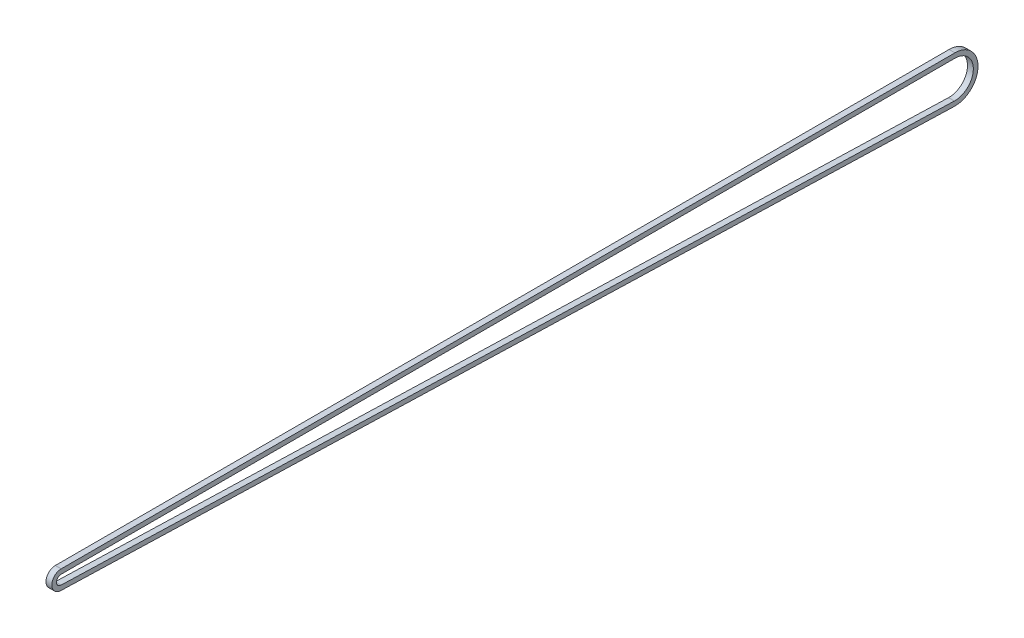
ISO-10303-21;
HEADER;
FILE_DESCRIPTION(('STEP AP214'),'2;1');
FILE_NAME('part.step','',(''),(''),'','','');
FILE_SCHEMA(('AUTOMOTIVE_DESIGN { 1 0 10303 214 1 1 1 1 }'));
ENDSEC;
DATA;
#1=APPLICATION_CONTEXT('core data for automotive mechanical design processes');
#2=APPLICATION_PROTOCOL_DEFINITION('international standard','automotive_design',2000,#1);
#3=PRODUCT_CONTEXT('',#1,'mechanical');
#4=PRODUCT('Part','Part','',(#3));
#5=PRODUCT_RELATED_PRODUCT_CATEGORY('part','',(#4));
#6=PRODUCT_DEFINITION_FORMATION('','',#4);
#7=PRODUCT_DEFINITION_CONTEXT('part definition',#1,'design');
#8=PRODUCT_DEFINITION('design','',#6,#7);
#9=PRODUCT_DEFINITION_SHAPE('','',#8);
#10=(LENGTH_UNIT() NAMED_UNIT(*) SI_UNIT(.MILLI.,.METRE.));
#11=(NAMED_UNIT(*) PLANE_ANGLE_UNIT() SI_UNIT($,.RADIAN.));
#12=(NAMED_UNIT(*) SI_UNIT($,.STERADIAN.) SOLID_ANGLE_UNIT());
#13=UNCERTAINTY_MEASURE_WITH_UNIT(LENGTH_MEASURE(1.E-05),#10,'distance_accuracy_value','');
#14=(GEOMETRIC_REPRESENTATION_CONTEXT(3) GLOBAL_UNCERTAINTY_ASSIGNED_CONTEXT((#13)) GLOBAL_UNIT_ASSIGNED_CONTEXT((#10,
#11,#12)) REPRESENTATION_CONTEXT('',''));
#15=CARTESIAN_POINT('',(0.,0.,0.));
#16=DIRECTION('',(0.,0.,1.));
#17=DIRECTION('',(1.,0.,0.));
#18=AXIS2_PLACEMENT_3D('',#15,#16,#17);
#19=CARTESIAN_POINT('',(5.,-7.996231397534,0.245526856151406));
#20=DIRECTION('',(0.,0.999528924691749,-0.0306908570189258));
#21=DIRECTION('',(0.,0.0306908570189258,0.999528924691749));
#22=AXIS2_PLACEMENT_3D('',#19,#20,#21);
#23=PLANE('',#22);
#24=DIRECTION('',(0.,-0.0306908570189258,-0.999528924691749));
#25=VECTOR('',#24,1.);
#26=CARTESIAN_POINT('',(0.,-7.996231397534,0.245526856151406));
#27=LINE('',#26,#25);
#28=CARTESIAN_POINT('',(0.,-7.996231397534,0.245526856151406));
#29=VERTEX_POINT('',#28);
#30=CARTESIAN_POINT('',(0.,-31.490696262662,-764.913855573876));
#31=VERTEX_POINT('',#30);
#32=EDGE_CURVE('E143',#29,#31,#27,.T.);
#33=ORIENTED_EDGE('',*,*,#32,.T.);
#34=DIRECTION('',(-1.,0.,0.));
#35=VECTOR('',#34,1.);
#36=CARTESIAN_POINT('',(5.,-31.490696262662,-764.913855573876));
#37=LINE('',#36,#35);
#38=CARTESIAN_POINT('',(5.,-31.490696262662,-764.913855573876));
#39=VERTEX_POINT('',#38);
#40=EDGE_CURVE('E11',#39,#31,#37,.T.);
#41=ORIENTED_EDGE('',*,*,#40,.F.);
#42=DIRECTION('',(0.,-0.0306908570189258,-0.999528924691749));
#43=VECTOR('',#42,1.);
#44=CARTESIAN_POINT('',(5.,-7.996231397534,0.245526856151406));
#45=LINE('',#44,#43);
#46=CARTESIAN_POINT('',(5.,-7.996231397534,0.245526856151406));
#47=VERTEX_POINT('',#46);
#48=EDGE_CURVE('E114',#47,#39,#45,.T.);
#49=ORIENTED_EDGE('',*,*,#48,.F.);
#50=DIRECTION('',(-1.,0.,0.));
#51=VECTOR('',#50,1.);
#52=CARTESIAN_POINT('',(5.,-7.996231397534,0.245526856151406));
#53=LINE('',#52,#51);
#54=EDGE_CURVE('E151',#47,#29,#53,.T.);
#55=ORIENTED_EDGE('',*,*,#54,.T.);
#56=EDGE_LOOP('',(#33,#41,#49,#55));
#57=FACE_BOUND('',#56,.T.);
#58=ADVANCED_FACE('F37',(#57),#23,.F.);
#59=CARTESIAN_POINT('',(5.,-11.75,-765.52));
#60=DIRECTION('',(-1.,0.,0.));
#61=DIRECTION('',(0.,0.,1.));
#62=AXIS2_PLACEMENT_3D('',#59,#60,#61);
#63=CYLINDRICAL_SURFACE('',#62,19.75);
#64=CARTESIAN_POINT('',(0.,-11.75,-765.52));
#65=DIRECTION('',(1.,0.,0.));
#66=DIRECTION('',(0.,0.,-1.));
#67=AXIS2_PLACEMENT_3D('',#64,#65,#66);
#68=CIRCLE('',#67,19.75);
#69=CARTESIAN_POINT('',(0.,8.,-765.52));
#70=VERTEX_POINT('',#69);
#71=EDGE_CURVE('E120',#31,#70,#68,.T.);
#72=ORIENTED_EDGE('',*,*,#71,.T.);
#73=DIRECTION('',(-1.,0.,0.));
#74=VECTOR('',#73,1.);
#75=CARTESIAN_POINT('',(5.,8.,-765.52));
#76=LINE('',#75,#74);
#77=CARTESIAN_POINT('',(5.,8.,-765.52));
#78=VERTEX_POINT('',#77);
#79=EDGE_CURVE('E47',#78,#70,#76,.T.);
#80=ORIENTED_EDGE('',*,*,#79,.F.);
#81=CARTESIAN_POINT('',(5.,-11.75,-765.52));
#82=DIRECTION('',(1.,0.,0.));
#83=DIRECTION('',(0.,0.,-1.));
#84=AXIS2_PLACEMENT_3D('',#81,#82,#83);
#85=CIRCLE('',#84,19.75);
#86=EDGE_CURVE('E108',#39,#78,#85,.T.);
#87=ORIENTED_EDGE('',*,*,#86,.F.);
#88=ORIENTED_EDGE('',*,*,#40,.T.);
#89=EDGE_LOOP('',(#72,#80,#87,#88));
#90=FACE_BOUND('',#89,.T.);
#91=ADVANCED_FACE('F119',(#90),#63,.T.);
#92=CARTESIAN_POINT('',(5.,8.,0.));
#93=DIRECTION('',(0.,1.,0.));
#94=DIRECTION('',(0.,0.,1.));
#95=AXIS2_PLACEMENT_3D('',#92,#93,#94);
#96=PLANE('',#95);
#97=DIRECTION('',(0.,0.,-1.));
#98=VECTOR('',#97,1.);
#99=CARTESIAN_POINT('',(0.,8.,0.));
#100=LINE('',#99,#98);
#101=CARTESIAN_POINT('',(0.,8.,0.));
#102=VERTEX_POINT('',#101);
#103=EDGE_CURVE('E147',#102,#70,#100,.T.);
#104=ORIENTED_EDGE('',*,*,#103,.F.);
#105=DIRECTION('',(-1.,0.,0.));
#106=VECTOR('',#105,1.);
#107=CARTESIAN_POINT('',(5.,8.,0.));
#108=LINE('',#107,#106);
#109=CARTESIAN_POINT('',(5.,8.,0.));
#110=VERTEX_POINT('',#109);
#111=EDGE_CURVE('E84',#110,#102,#108,.T.);
#112=ORIENTED_EDGE('',*,*,#111,.F.);
#113=DIRECTION('',(0.,0.,-1.));
#114=VECTOR('',#113,1.);
#115=CARTESIAN_POINT('',(5.,8.,0.));
#116=LINE('',#115,#114);
#117=EDGE_CURVE('E112',#110,#78,#116,.T.);
#118=ORIENTED_EDGE('',*,*,#117,.T.);
#119=ORIENTED_EDGE('',*,*,#79,.T.);
#120=EDGE_LOOP('',(#104,#112,#118,#119));
#121=FACE_BOUND('',#120,.T.);
#122=ADVANCED_FACE('F125',(#121),#96,.T.);
#123=CARTESIAN_POINT('',(5.,0.,0.));
#124=DIRECTION('',(-1.,0.,0.));
#125=DIRECTION('',(0.,0.,1.));
#126=AXIS2_PLACEMENT_3D('',#123,#124,#125);
#127=CYLINDRICAL_SURFACE('',#126,4.);
#128=CARTESIAN_POINT('',(0.,0.,0.));
#129=DIRECTION('',(1.,0.,0.));
#130=DIRECTION('',(0.,0.,-1.));
#131=AXIS2_PLACEMENT_3D('',#128,#129,#130);
#132=CIRCLE('',#131,4.);
#133=CARTESIAN_POINT('',(0.,4.,0.));
#134=VERTEX_POINT('',#133);
#135=CARTESIAN_POINT('',(0.,-3.99811569876701,0.122763428075703));
#136=VERTEX_POINT('',#135);
#137=EDGE_CURVE('E131',#134,#136,#132,.T.);
#138=ORIENTED_EDGE('',*,*,#137,.F.);
#139=DIRECTION('',(-1.,0.,0.));
#140=VECTOR('',#139,1.);
#141=CARTESIAN_POINT('',(5.,4.,0.));
#142=LINE('',#141,#140);
#143=CARTESIAN_POINT('',(5.,4.,0.));
#144=VERTEX_POINT('',#143);
#145=EDGE_CURVE('E41',#144,#134,#142,.T.);
#146=ORIENTED_EDGE('',*,*,#145,.F.);
#147=CARTESIAN_POINT('',(5.,0.,0.));
#148=DIRECTION('',(1.,0.,0.));
#149=DIRECTION('',(0.,0.,-1.));
#150=AXIS2_PLACEMENT_3D('',#147,#148,#149);
#151=CIRCLE('',#150,4.);
#152=CARTESIAN_POINT('',(5.,-3.99811569876701,0.122763428075703));
#153=VERTEX_POINT('',#152);
#154=EDGE_CURVE('E150',#144,#153,#151,.T.);
#155=ORIENTED_EDGE('',*,*,#154,.T.);
#156=DIRECTION('',(-1.,0.,0.));
#157=VECTOR('',#156,1.);
#158=CARTESIAN_POINT('',(5.,-3.99811569876701,0.122763428075703));
#159=LINE('',#158,#157);
#160=EDGE_CURVE('E127',#153,#136,#159,.T.);
#161=ORIENTED_EDGE('',*,*,#160,.T.);
#162=EDGE_LOOP('',(#138,#146,#155,#161));
#163=FACE_BOUND('',#162,.T.);
#164=ADVANCED_FACE('F39',(#163),#127,.F.);
#165=CARTESIAN_POINT('',(5.,4.,0.));
#166=DIRECTION('',(0.,1.,0.));
#167=DIRECTION('',(0.,0.,1.));
#168=AXIS2_PLACEMENT_3D('',#165,#166,#167);
#169=PLANE('',#168);
#170=DIRECTION('',(0.,0.,-1.));
#171=VECTOR('',#170,1.);
#172=CARTESIAN_POINT('',(0.,4.,0.));
#173=LINE('',#172,#171);
#174=CARTESIAN_POINT('',(0.,4.,-765.52));
#175=VERTEX_POINT('',#174);
#176=EDGE_CURVE('E134',#134,#175,#173,.T.);
#177=ORIENTED_EDGE('',*,*,#176,.T.);
#178=DIRECTION('',(-1.,0.,0.));
#179=VECTOR('',#178,1.);
#180=CARTESIAN_POINT('',(5.,4.,-765.52));
#181=LINE('',#180,#179);
#182=CARTESIAN_POINT('',(5.,4.,-765.52));
#183=VERTEX_POINT('',#182);
#184=EDGE_CURVE('E156',#183,#175,#181,.T.);
#185=ORIENTED_EDGE('',*,*,#184,.F.);
#186=DIRECTION('',(0.,0.,-1.));
#187=VECTOR('',#186,1.);
#188=CARTESIAN_POINT('',(5.,4.,0.));
#189=LINE('',#188,#187);
#190=EDGE_CURVE('E164',#144,#183,#189,.T.);
#191=ORIENTED_EDGE('',*,*,#190,.F.);
#192=ORIENTED_EDGE('',*,*,#145,.T.);
#193=EDGE_LOOP('',(#177,#185,#191,#192));
#194=FACE_BOUND('',#193,.T.);
#195=ADVANCED_FACE('F163',(#194),#169,.F.);
#196=CARTESIAN_POINT('',(5.,-11.75,-765.52));
#197=DIRECTION('',(-1.,0.,0.));
#198=DIRECTION('',(0.,0.,1.));
#199=AXIS2_PLACEMENT_3D('',#196,#197,#198);
#200=CYLINDRICAL_SURFACE('',#199,15.7500000000001);
#201=CARTESIAN_POINT('',(0.,-11.75,-765.52));
#202=DIRECTION('',(1.,0.,0.));
#203=DIRECTION('',(0.,0.,-1.));
#204=AXIS2_PLACEMENT_3D('',#201,#202,#203);
#205=CIRCLE('',#204,15.7500000000001);
#206=CARTESIAN_POINT('',(0.,-27.4925805638951,-765.036619001952));
#207=VERTEX_POINT('',#206);
#208=EDGE_CURVE('E137',#207,#175,#205,.T.);
#209=ORIENTED_EDGE('',*,*,#208,.F.);
#210=DIRECTION('',(-1.,0.,0.));
#211=VECTOR('',#210,1.);
#212=CARTESIAN_POINT('',(5.,-27.4925805638951,-765.036619001952));
#213=LINE('',#212,#211);
#214=CARTESIAN_POINT('',(5.,-27.4925805638951,-765.036619001952));
#215=VERTEX_POINT('',#214);
#216=EDGE_CURVE('E155',#215,#207,#213,.T.);
#217=ORIENTED_EDGE('',*,*,#216,.F.);
#218=CARTESIAN_POINT('',(5.,-11.75,-765.52));
#219=DIRECTION('',(1.,0.,0.));
#220=DIRECTION('',(0.,0.,-1.));
#221=AXIS2_PLACEMENT_3D('',#218,#219,#220);
#222=CIRCLE('',#221,15.7500000000001);
#223=EDGE_CURVE('E176',#215,#183,#222,.T.);
#224=ORIENTED_EDGE('',*,*,#223,.T.);
#225=ORIENTED_EDGE('',*,*,#184,.T.);
#226=EDGE_LOOP('',(#209,#217,#224,#225));
#227=FACE_BOUND('',#226,.T.);
#228=ADVANCED_FACE('F174',(#227),#200,.F.);
#229=CARTESIAN_POINT('',(5.,-3.99811569876701,0.122763428075704));
#230=DIRECTION('',(0.,-0.999528924691749,0.0306908570189258));
#231=DIRECTION('',(0.,-0.0306908570189258,-0.999528924691749));
#232=AXIS2_PLACEMENT_3D('',#229,#230,#231);
#233=PLANE('',#232);
#234=DIRECTION('',(0.,0.0306908570189258,0.999528924691749));
#235=VECTOR('',#234,1.);
#236=CARTESIAN_POINT('',(0.,-3.99811569876701,0.122763428075704));
#237=LINE('',#236,#235);
#238=EDGE_CURVE('E140',#207,#136,#237,.T.);
#239=ORIENTED_EDGE('',*,*,#238,.T.);
#240=ORIENTED_EDGE('',*,*,#160,.F.);
#241=DIRECTION('',(0.,0.0306908570189258,0.999528924691749));
#242=VECTOR('',#241,1.);
#243=CARTESIAN_POINT('',(5.,-3.99811569876701,0.122763428075704));
#244=LINE('',#243,#242);
#245=EDGE_CURVE('E177',#215,#153,#244,.T.);
#246=ORIENTED_EDGE('',*,*,#245,.F.);
#247=ORIENTED_EDGE('',*,*,#216,.T.);
#248=EDGE_LOOP('',(#239,#240,#246,#247));
#249=FACE_BOUND('',#248,.T.);
#250=ADVANCED_FACE('F173',(#249),#233,.F.);
#251=CARTESIAN_POINT('',(5.,0.,0.));
#252=DIRECTION('',(-1.,0.,0.));
#253=DIRECTION('',(0.,0.,1.));
#254=AXIS2_PLACEMENT_3D('',#251,#252,#253);
#255=CYLINDRICAL_SURFACE('',#254,8.);
#256=CARTESIAN_POINT('',(0.,0.,0.));
#257=DIRECTION('',(1.,0.,0.));
#258=DIRECTION('',(0.,0.,-1.));
#259=AXIS2_PLACEMENT_3D('',#256,#257,#258);
#260=CIRCLE('',#259,8.);
#261=EDGE_CURVE('E87',#102,#29,#260,.T.);
#262=ORIENTED_EDGE('',*,*,#261,.T.);
#263=ORIENTED_EDGE('',*,*,#54,.F.);
#264=CARTESIAN_POINT('',(5.,0.,0.));
#265=DIRECTION('',(1.,0.,0.));
#266=DIRECTION('',(0.,0.,-1.));
#267=AXIS2_PLACEMENT_3D('',#264,#265,#266);
#268=CIRCLE('',#267,8.);
#269=EDGE_CURVE('E56',#110,#47,#268,.T.);
#270=ORIENTED_EDGE('',*,*,#269,.F.);
#271=ORIENTED_EDGE('',*,*,#111,.T.);
#272=EDGE_LOOP('',(#262,#263,#270,#271));
#273=FACE_BOUND('',#272,.T.);
#274=ADVANCED_FACE('F184',(#273),#255,.T.);
#275=CARTESIAN_POINT('',(5.,0.,0.));
#276=DIRECTION('',(1.,0.,0.));
#277=DIRECTION('',(0.,0.,-1.));
#278=AXIS2_PLACEMENT_3D('',#275,#276,#277);
#279=PLANE('',#278);
#280=ORIENTED_EDGE('',*,*,#154,.F.);
#281=ORIENTED_EDGE('',*,*,#190,.T.);
#282=ORIENTED_EDGE('',*,*,#223,.F.);
#283=ORIENTED_EDGE('',*,*,#245,.T.);
#284=EDGE_LOOP('',(#280,#281,#282,#283));
#285=FACE_BOUND('',#284,.T.);
#286=ORIENTED_EDGE('',*,*,#48,.T.);
#287=ORIENTED_EDGE('',*,*,#86,.T.);
#288=ORIENTED_EDGE('',*,*,#117,.F.);
#289=ORIENTED_EDGE('',*,*,#269,.T.);
#290=EDGE_LOOP('',(#286,#287,#288,#289));
#291=FACE_BOUND('',#290,.T.);
#292=ADVANCED_FACE('F110',(#285,#291),#279,.T.);
#293=CARTESIAN_POINT('',(0.,0.,0.));
#294=DIRECTION('',(1.,0.,0.));
#295=DIRECTION('',(0.,0.,-1.));
#296=AXIS2_PLACEMENT_3D('',#293,#294,#295);
#297=PLANE('',#296);
#298=ORIENTED_EDGE('',*,*,#137,.T.);
#299=ORIENTED_EDGE('',*,*,#238,.F.);
#300=ORIENTED_EDGE('',*,*,#208,.T.);
#301=ORIENTED_EDGE('',*,*,#176,.F.);
#302=EDGE_LOOP('',(#298,#299,#300,#301));
#303=FACE_BOUND('',#302,.T.);
#304=ORIENTED_EDGE('',*,*,#32,.F.);
#305=ORIENTED_EDGE('',*,*,#261,.F.);
#306=ORIENTED_EDGE('',*,*,#103,.T.);
#307=ORIENTED_EDGE('',*,*,#71,.F.);
#308=EDGE_LOOP('',(#304,#305,#306,#307));
#309=FACE_BOUND('',#308,.T.);
#310=ADVANCED_FACE('F167',(#303,#309),#297,.F.);
#311=CLOSED_SHELL('',(#58,#91,#122,#164,#195,#228,#250,#274,#292,#310));
#312=MANIFOLD_SOLID_BREP('B2',#311);
#313=ADVANCED_BREP_SHAPE_REPRESENTATION('',(#18,#312),#14);
#314=SHAPE_DEFINITION_REPRESENTATION(#9,#313);
ENDSEC;
END-ISO-10303-21;
